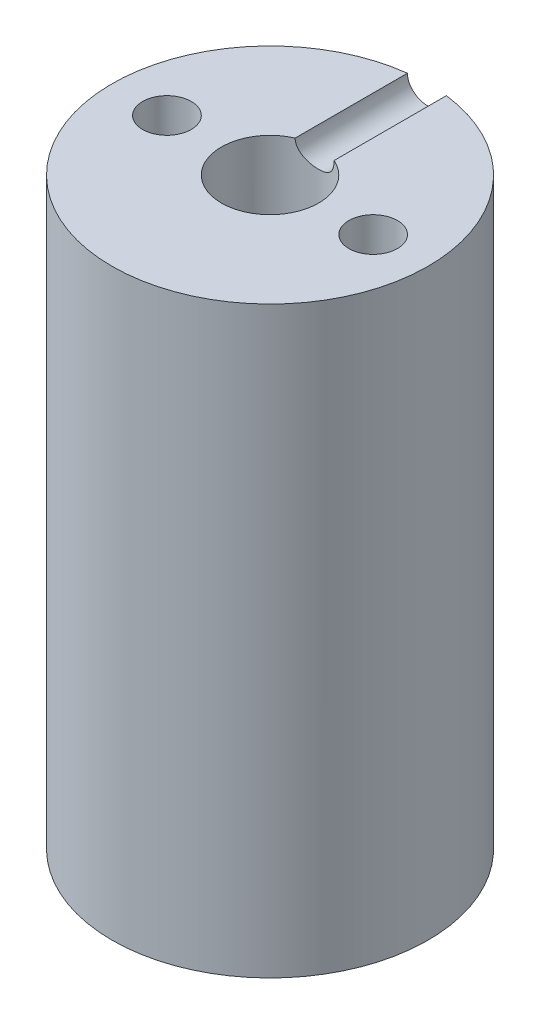
ISO-10303-21;
HEADER;
FILE_DESCRIPTION(('STEP AP214'),'2;1');
FILE_NAME('part.step','',(''),(''),'','','');
FILE_SCHEMA(('AUTOMOTIVE_DESIGN { 1 0 10303 214 1 1 1 1 }'));
ENDSEC;
DATA;
#1=APPLICATION_CONTEXT('core data for automotive mechanical design processes');
#2=APPLICATION_PROTOCOL_DEFINITION('international standard','automotive_design',2000,#1);
#3=PRODUCT_CONTEXT('',#1,'mechanical');
#4=PRODUCT('Part','Part','',(#3));
#5=PRODUCT_RELATED_PRODUCT_CATEGORY('part','',(#4));
#6=PRODUCT_DEFINITION_FORMATION('','',#4);
#7=PRODUCT_DEFINITION_CONTEXT('part definition',#1,'design');
#8=PRODUCT_DEFINITION('design','',#6,#7);
#9=PRODUCT_DEFINITION_SHAPE('','',#8);
#10=(LENGTH_UNIT() NAMED_UNIT(*) SI_UNIT(.MILLI.,.METRE.));
#11=(NAMED_UNIT(*) PLANE_ANGLE_UNIT() SI_UNIT($,.RADIAN.));
#12=(NAMED_UNIT(*) SI_UNIT($,.STERADIAN.) SOLID_ANGLE_UNIT());
#13=UNCERTAINTY_MEASURE_WITH_UNIT(LENGTH_MEASURE(1.E-05),#10,'distance_accuracy_value','');
#14=(GEOMETRIC_REPRESENTATION_CONTEXT(3) GLOBAL_UNCERTAINTY_ASSIGNED_CONTEXT((#13)) GLOBAL_UNIT_ASSIGNED_CONTEXT((#10,
#11,#12)) REPRESENTATION_CONTEXT('',''));
#15=CARTESIAN_POINT('',(0.,0.,0.));
#16=DIRECTION('',(0.,0.,1.));
#17=DIRECTION('',(1.,0.,0.));
#18=AXIS2_PLACEMENT_3D('',#15,#16,#17);
#19=CARTESIAN_POINT('',(0.,76.2,0.));
#20=DIRECTION('',(0.,-1.,0.));
#21=DIRECTION('',(0.,0.,-1.));
#22=AXIS2_PLACEMENT_3D('',#19,#20,#21);
#23=CYLINDRICAL_SURFACE('',#22,20.6375);
#24=CARTESIAN_POINT('',(0.,76.2,0.));
#25=DIRECTION('',(0.,1.,0.));
#26=DIRECTION('',(0.,0.,1.));
#27=AXIS2_PLACEMENT_3D('',#24,#25,#26);
#28=CIRCLE('',#27,20.6375);
#29=CARTESIAN_POINT('',(-2.54,76.2,-20.4805958470451));
#30=VERTEX_POINT('',#29);
#31=CARTESIAN_POINT('',(2.54,76.2,-20.4805958470451));
#32=VERTEX_POINT('',#31);
#33=EDGE_CURVE('E53',#30,#32,#28,.T.);
#34=ORIENTED_EDGE('',*,*,#33,.F.);
#35=CARTESIAN_POINT('',(-2.54,76.2,-20.4805958470451));
#36=CARTESIAN_POINT('',(-2.5400071588606,76.1288480355115,-20.4805921809015));
#37=CARTESIAN_POINT('',(-2.53701032269649,76.0576996859673,-20.4809665544155));
#38=CARTESIAN_POINT('',(-2.52506411090304,75.915917352227,-20.4824442830245));
#39=CARTESIAN_POINT('',(-2.51611518832987,75.8452833292955,-20.4835475826356));
#40=CARTESIAN_POINT('',(-2.49233229465288,75.705096864364,-20.4864545997556));
#41=CARTESIAN_POINT('',(-2.47750429621881,75.6355433988978,-20.4882576063791));
#42=CARTESIAN_POINT('',(-2.44208770085148,75.4979596282379,-20.4925090968478));
#43=CARTESIAN_POINT('',(-2.42149913929293,75.4299293136936,-20.4949575767292));
#44=CARTESIAN_POINT('',(-2.35127370838327,75.2287969813616,-20.5031747572653));
#45=CARTESIAN_POINT('',(-2.29316365377516,75.0985748527493,-20.509816946158));
#46=CARTESIAN_POINT('',(-2.15610559582313,74.8498127921764,-20.5246762047259));
#47=CARTESIAN_POINT('',(-2.07715929335851,74.731271907751,-20.5328931458378));
#48=CARTESIAN_POINT('',(-1.90019791291911,74.5085018373569,-20.5500261106532));
#49=CARTESIAN_POINT('',(-1.80209402692225,74.4043433171231,-20.5589452700302));
#50=CARTESIAN_POINT('',(-1.5897873659417,74.2139189052477,-20.5764502624073));
#51=CARTESIAN_POINT('',(-1.47558214188864,74.1276557404939,-20.5850360444459));
#52=CARTESIAN_POINT('',(-1.23387054160637,73.9752212285859,-20.6009384026917));
#53=CARTESIAN_POINT('',(-1.10632299970461,73.9091146833245,-20.608250853591));
#54=CARTESIAN_POINT('',(-0.841839477743067,73.799290389379,-20.6207472905727));
#55=CARTESIAN_POINT('',(-0.704904393498588,73.7555705077887,-20.6259314794174));
#56=CARTESIAN_POINT('',(-0.42626121046321,73.6919690022915,-20.633565487627));
#57=CARTESIAN_POINT('',(-0.2845807789102,73.6719678391385,-20.6360290144145));
#58=CARTESIAN_POINT('',(0.000149071372596135,73.6560011471766,-20.6379909449255));
#59=CARTESIAN_POINT('',(0.14319847093767,73.6600352823782,-20.6374893900978));
#60=CARTESIAN_POINT('',(0.425784783451287,73.691929591275,-20.633588661675));
#61=CARTESIAN_POINT('',(0.565336530118757,73.7196605297987,-20.6302052054183));
#62=CARTESIAN_POINT('',(0.837789547361134,73.7979591889525,-20.6209385631256));
#63=CARTESIAN_POINT('',(0.970690730687044,73.848527209096,-20.6150553443047));
#64=CARTESIAN_POINT('',(1.22647394699941,73.9712034185426,-20.6014230665233));
#65=CARTESIAN_POINT('',(1.34932863545446,74.0433680573713,-20.5936691282754));
#66=CARTESIAN_POINT('',(1.58122727019245,74.2071449762817,-20.5771635946295));
#67=CARTESIAN_POINT('',(1.69027118836836,74.2987572959413,-20.5684119972011));
#68=CARTESIAN_POINT('',(1.89220396367486,74.4995385730927,-20.5508231307746));
#69=CARTESIAN_POINT('',(1.98498321445238,74.6088177700546,-20.5419856746523));
#70=CARTESIAN_POINT('',(2.15092748188035,74.8414970416285,-20.525274615356));
#71=CARTESIAN_POINT('',(2.22408665758268,74.9649013057445,-20.5174012995872));
#72=CARTESIAN_POINT('',(2.34871830213628,75.222440824418,-20.5035089759848));
#73=CARTESIAN_POINT('',(2.40016923674,75.3565865782031,-20.4974918110077));
#74=CARTESIAN_POINT('',(2.47970808533735,75.631606962008,-20.4880229745246));
#75=CARTESIAN_POINT('',(2.50783119459685,75.7724711149785,-20.4845674390652));
#76=CARTESIAN_POINT('',(2.52927389550729,75.9619554690381,-20.4819235361353));
#77=CARTESIAN_POINT('',(2.53329810044395,76.0095162489759,-20.4814260031924));
#78=CARTESIAN_POINT('',(2.53865755227299,76.104711313363,-20.480762547683));
#79=CARTESIAN_POINT('',(2.53999730397778,76.1523453402007,-20.480596069573));
#80=CARTESIAN_POINT('',(2.54,76.2,-20.4805958470451));
#81=B_SPLINE_CURVE_WITH_KNOTS('',3,(#35,#36,#37,#38,#39,#40,#41,#42,#43,#44,#45,#46,#47,#48,#49,
#50,#51,#52,#53,#54,#55,#56,#57,#58,#59,#60,#61,#62,#63,#64,#65,#66,#67,#68,#69,#70,#71,#72,#73,
#74,#75,#76,#77,#78,#79,#80),.UNSPECIFIED.,.F.,.F.,(4,2,2,2,2,2,2,2,2,2,2,2,2,2,2,2,2,2,2,2,2,2,
4),(0.,0.213385389863619,0.426754539287415,0.63990747591402,0.853059103630533,1.27912573596953,
1.70515759890545,2.13321340539498,2.56133439104137,2.9908175810027,3.42025984401112,
3.84752844912171,4.27479108145877,4.69973831665756,5.12469112529465,5.55076452924861,
5.97683880031326,6.40568234442481,6.83465341502585,7.26404902363532,7.69279560805967,
7.83593965688664,7.97884329215184),.UNSPECIFIED.);
#82=EDGE_CURVE('E64',#30,#32,#81,.T.);
#83=ORIENTED_EDGE('',*,*,#82,.T.);
#84=EDGE_LOOP('',(#34,#83));
#85=FACE_BOUND('',#84,.T.);
#86=CARTESIAN_POINT('',(0.,0.,0.));
#87=DIRECTION('',(0.,1.,0.));
#88=DIRECTION('',(0.,0.,1.));
#89=AXIS2_PLACEMENT_3D('',#86,#87,#88);
#90=CIRCLE('',#89,20.6375);
#91=CARTESIAN_POINT('',(0.,0.,20.6375));
#92=VERTEX_POINT('',#91);
#93=EDGE_CURVE('E89',#92,#92,#90,.T.);
#94=ORIENTED_EDGE('',*,*,#93,.T.);
#95=EDGE_LOOP('',(#94));
#96=FACE_BOUND('',#95,.T.);
#97=ADVANCED_FACE('F38',(#85,#96),#23,.T.);
#98=CARTESIAN_POINT('',(0.,76.2,0.));
#99=DIRECTION('',(0.,1.,0.));
#100=DIRECTION('',(0.,0.,1.));
#101=AXIS2_PLACEMENT_3D('',#98,#99,#100);
#102=PLANE('',#101);
#103=CARTESIAN_POINT('',(-13.462,76.2,0.));
#104=DIRECTION('',(0.,1.,0.));
#105=DIRECTION('',(0.,0.,1.));
#106=AXIS2_PLACEMENT_3D('',#103,#104,#105);
#107=CIRCLE('',#106,3.175);
#108=CARTESIAN_POINT('',(-13.462,76.2,3.175));
#109=VERTEX_POINT('',#108);
#110=EDGE_CURVE('E187',#109,#109,#107,.T.);
#111=ORIENTED_EDGE('',*,*,#110,.F.);
#112=EDGE_LOOP('',(#111));
#113=FACE_BOUND('',#112,.T.);
#114=CARTESIAN_POINT('',(13.462,76.2,0.));
#115=DIRECTION('',(0.,1.,0.));
#116=DIRECTION('',(0.,0.,-1.));
#117=AXIS2_PLACEMENT_3D('',#114,#115,#116);
#118=CIRCLE('',#117,3.175);
#119=CARTESIAN_POINT('',(13.462,76.2,-3.175));
#120=VERTEX_POINT('',#119);
#121=EDGE_CURVE('E179',#120,#120,#118,.T.);
#122=ORIENTED_EDGE('',*,*,#121,.F.);
#123=EDGE_LOOP('',(#122));
#124=FACE_BOUND('',#123,.T.);
#125=DIRECTION('',(0.,0.,1.));
#126=VECTOR('',#125,1.);
#127=CARTESIAN_POINT('',(-2.54,76.2,0.));
#128=LINE('',#127,#126);
#129=CARTESIAN_POINT('',(-2.54,76.2,-5.81987113259392));
#130=VERTEX_POINT('',#129);
#131=EDGE_CURVE('E60',#30,#130,#128,.T.);
#132=ORIENTED_EDGE('',*,*,#131,.F.);
#133=ORIENTED_EDGE('',*,*,#33,.T.);
#134=DIRECTION('',(0.,0.,1.));
#135=VECTOR('',#134,1.);
#136=CARTESIAN_POINT('',(2.54,76.2,0.));
#137=LINE('',#136,#135);
#138=CARTESIAN_POINT('',(2.54,76.2,-5.81987113259392));
#139=VERTEX_POINT('',#138);
#140=EDGE_CURVE('E70',#139,#32,#137,.F.);
#141=ORIENTED_EDGE('',*,*,#140,.F.);
#142=CARTESIAN_POINT('',(0.,76.2,0.));
#143=DIRECTION('',(0.,1.,0.));
#144=DIRECTION('',(0.,0.,1.));
#145=AXIS2_PLACEMENT_3D('',#142,#143,#144);
#146=CIRCLE('',#145,6.35);
#147=EDGE_CURVE('E77',#130,#139,#146,.T.);
#148=ORIENTED_EDGE('',*,*,#147,.F.);
#149=EDGE_LOOP('',(#132,#133,#141,#148));
#150=FACE_BOUND('',#149,.T.);
#151=ADVANCED_FACE('F76',(#113,#124,#150),#102,.T.);
#152=CARTESIAN_POINT('',(0.,0.,0.));
#153=DIRECTION('',(0.,1.,0.));
#154=DIRECTION('',(0.,0.,1.));
#155=AXIS2_PLACEMENT_3D('',#152,#153,#154);
#156=PLANE('',#155);
#157=ORIENTED_EDGE('',*,*,#93,.F.);
#158=EDGE_LOOP('',(#157));
#159=FACE_BOUND('',#158,.T.);
#160=ADVANCED_FACE('F99',(#159),#156,.F.);
#161=CARTESIAN_POINT('',(0.,38.1,0.));
#162=DIRECTION('',(0.,1.,0.));
#163=DIRECTION('',(0.,0.,1.));
#164=AXIS2_PLACEMENT_3D('',#161,#162,#163);
#165=CYLINDRICAL_SURFACE('',#164,6.35);
#166=CARTESIAN_POINT('',(0.,38.1,0.));
#167=DIRECTION('',(0.,1.,0.));
#168=DIRECTION('',(0.,0.,1.));
#169=AXIS2_PLACEMENT_3D('',#166,#167,#168);
#170=CIRCLE('',#169,6.35);
#171=CARTESIAN_POINT('',(0.,38.1,6.35));
#172=VERTEX_POINT('',#171);
#173=EDGE_CURVE('E84',#172,#172,#170,.T.);
#174=ORIENTED_EDGE('',*,*,#173,.F.);
#175=EDGE_LOOP('',(#174));
#176=FACE_BOUND('',#175,.T.);
#177=ORIENTED_EDGE('',*,*,#147,.T.);
#178=CARTESIAN_POINT('',(2.54,76.2,-5.81987113259392));
#179=CARTESIAN_POINT('',(2.54001013506161,76.1316665673217,-5.81985709877384));
#180=CARTESIAN_POINT('',(2.53724272034852,76.0633408047418,-5.821074287182));
#181=CARTESIAN_POINT('',(2.52623200586277,75.9272404512165,-5.8258662428028));
#182=CARTESIAN_POINT('',(2.51799079165366,75.8594656602978,-5.82944011209652));
#183=CARTESIAN_POINT('',(2.49615456668989,75.7252145366203,-5.83882224309212));
#184=CARTESIAN_POINT('',(2.48258071961951,75.6587341482641,-5.84462167011267));
#185=CARTESIAN_POINT('',(2.45023170342138,75.5272800199226,-5.85825667686786));
#186=CARTESIAN_POINT('',(2.43145621679704,75.462306372168,-5.86609238089056));
#187=CARTESIAN_POINT('',(2.36762254177773,75.2704414697609,-5.89228299885495));
#188=CARTESIAN_POINT('',(2.31501301614209,75.146339127024,-5.91334160429937));
#189=CARTESIAN_POINT('',(2.19136203322062,74.908669613295,-5.96026710872033));
#190=CARTESIAN_POINT('',(2.12030305347894,74.7951125977387,-5.98613857207289));
#191=CARTESIAN_POINT('',(1.95747431385804,74.5753367562237,-6.04140269240685));
#192=CARTESIAN_POINT('',(1.86482880770765,74.4697936345113,-6.07090791957106));
#193=CARTESIAN_POINT('',(1.66331450643783,74.2752638542923,-6.12918243996794));
#194=CARTESIAN_POINT('',(1.55444238894593,74.1862805948005,-6.15795158107147));
#195=CARTESIAN_POINT('',(1.31826750327388,74.0239738793715,-6.21288339724724));
#196=CARTESIAN_POINT('',(1.1904064749747,73.9514080922373,-6.23889817170281));
#197=CARTESIAN_POINT('',(0.923066661923293,73.8291080276854,-6.28401009038758));
#198=CARTESIAN_POINT('',(0.783592754663287,73.7793642214544,-6.30311012101127));
#199=CARTESIAN_POINT('',(0.50414865044553,73.7065566743356,-6.33143659610334));
#200=CARTESIAN_POINT('',(0.364529439244347,73.6823177723498,-6.34109631635825));
#201=CARTESIAN_POINT('',(0.0828909066796626,73.6574238304691,-6.35101993955421));
#202=CARTESIAN_POINT('',(-0.0591275465712331,73.6567604357103,-6.35128717107505));
#203=CARTESIAN_POINT('',(-0.333036387807749,73.6783932057329,-6.34265889257385));
#204=CARTESIAN_POINT('',(-0.465047587182576,73.6994018092755,-6.33427721692996));
#205=CARTESIAN_POINT('',(-0.723486978857285,73.7615916523585,-6.30998573461176));
#206=CARTESIAN_POINT('',(-0.849914854746549,73.8027740335651,-6.29407550188619));
#207=CARTESIAN_POINT('',(-1.09587987461522,73.9046480964572,-6.25597974858417));
#208=CARTESIAN_POINT('',(-1.21528440122008,73.9656245358219,-6.23370323932263));
#209=CARTESIAN_POINT('',(-1.4424754858965,74.1050900275232,-6.1850854455788));
#210=CARTESIAN_POINT('',(-1.5502579483629,74.1835852237347,-6.15874273607117));
#211=CARTESIAN_POINT('',(-1.75864950871243,74.3618581088975,-6.10262664057142));
#212=CARTESIAN_POINT('',(-1.85832458268595,74.4626939427147,-6.07274156392338));
#213=CARTESIAN_POINT('',(-2.03974606122483,74.6797847207207,-6.01423677124468));
#214=CARTESIAN_POINT('',(-2.1214842978397,74.796046651028,-5.9856176364063));
#215=CARTESIAN_POINT('',(-2.26686945582334,75.0448972607396,-5.93211524880075));
#216=CARTESIAN_POINT('',(-2.32992843918133,75.1778593425671,-5.90736311739907));
#217=CARTESIAN_POINT('',(-2.43232048911978,75.4536991360169,-5.86595353417017));
#218=CARTESIAN_POINT('',(-2.47169553922447,75.5965587981179,-5.84928176886729));
#219=CARTESIAN_POINT('',(-2.5121943891885,75.8174044153816,-5.83194545483372));
#220=CARTESIAN_POINT('',(-2.52260741560886,75.8934950876132,-5.82743865854726));
#221=CARTESIAN_POINT('',(-2.53651108271748,76.0463744741239,-5.82139476198816));
#222=CARTESIAN_POINT('',(-2.54000598891897,76.1231627289315,-5.81985583183));
#223=CARTESIAN_POINT('',(-2.54,76.2,-5.81987113259392));
#224=B_SPLINE_CURVE_WITH_KNOTS('',3,(#178,#179,#180,#181,#182,#183,#184,#185,#186,#187,#188,
#189,#190,#191,#192,#193,#194,#195,#196,#197,#198,#199,#200,#201,#202,#203,#204,#205,#206,#207,
#208,#209,#210,#211,#212,#213,#214,#215,#216,#217,#218,#219,#220,#221,#222,#223),.UNSPECIFIED.,
.F.,.F.,(4,2,2,2,2,2,2,2,2,2,2,2,2,2,2,2,2,2,2,2,2,2,4),(0.,0.204920663435501,0.40976329513167,
0.613801047289903,0.817851256207235,1.22514741220868,1.63283182377135,2.06143920954285,
2.49013447284775,2.93576830835721,3.38121590960601,3.80509623160424,4.22882633423615,
4.62875522379612,5.02870674858182,5.43468784697986,5.84081154838935,6.27356980836772,
6.70652472768326,7.15193186765878,7.59654710801328,7.82701244547751,8.05733564035148),.UNSPECIFIED.);
#225=EDGE_CURVE('E11',#139,#130,#224,.T.);
#226=ORIENTED_EDGE('',*,*,#225,.T.);
#227=EDGE_LOOP('',(#177,#226));
#228=FACE_BOUND('',#227,.T.);
#229=ADVANCED_FACE('F82',(#176,#228),#165,.F.);
#230=CARTESIAN_POINT('',(0.,38.1,0.));
#231=DIRECTION('',(0.,1.,0.));
#232=DIRECTION('',(0.,0.,1.));
#233=AXIS2_PLACEMENT_3D('',#230,#231,#232);
#234=PLANE('',#233);
#235=ORIENTED_EDGE('',*,*,#173,.T.);
#236=EDGE_LOOP('',(#235));
#237=FACE_BOUND('',#236,.T.);
#238=ADVANCED_FACE('F105',(#237),#234,.T.);
#239=CARTESIAN_POINT('',(0.,76.2,0.));
#240=DIRECTION('',(0.,0.,1.));
#241=DIRECTION('',(1.,0.,0.));
#242=AXIS2_PLACEMENT_3D('',#239,#240,#241);
#243=CYLINDRICAL_SURFACE('',#242,2.54);
#244=ORIENTED_EDGE('',*,*,#131,.T.);
#245=ORIENTED_EDGE('',*,*,#225,.F.);
#246=ORIENTED_EDGE('',*,*,#140,.T.);
#247=ORIENTED_EDGE('',*,*,#82,.F.);
#248=EDGE_LOOP('',(#244,#245,#246,#247));
#249=FACE_BOUND('',#248,.T.);
#250=ADVANCED_FACE('F69',(#249),#243,.F.);
#251=CARTESIAN_POINT('',(13.462,69.85,0.));
#252=DIRECTION('',(0.,1.,0.));
#253=DIRECTION('',(0.,0.,1.));
#254=AXIS2_PLACEMENT_3D('',#251,#252,#253);
#255=CYLINDRICAL_SURFACE('',#254,3.175);
#256=CARTESIAN_POINT('',(13.462,69.85,0.));
#257=DIRECTION('',(0.,1.,0.));
#258=DIRECTION('',(0.,0.,-1.));
#259=AXIS2_PLACEMENT_3D('',#256,#257,#258);
#260=CIRCLE('',#259,3.175);
#261=CARTESIAN_POINT('',(13.462,69.85,-3.175));
#262=VERTEX_POINT('',#261);
#263=EDGE_CURVE('E183',#262,#262,#260,.T.);
#264=ORIENTED_EDGE('',*,*,#263,.F.);
#265=EDGE_LOOP('',(#264));
#266=FACE_BOUND('',#265,.T.);
#267=ORIENTED_EDGE('',*,*,#121,.T.);
#268=EDGE_LOOP('',(#267));
#269=FACE_BOUND('',#268,.T.);
#270=ADVANCED_FACE('F129',(#266,#269),#255,.F.);
#271=CARTESIAN_POINT('',(13.462,69.85,0.));
#272=DIRECTION('',(0.,-1.,0.));
#273=DIRECTION('',(0.,0.,-1.));
#274=AXIS2_PLACEMENT_3D('',#271,#272,#273);
#275=PLANE('',#274);
#276=ORIENTED_EDGE('',*,*,#263,.T.);
#277=EDGE_LOOP('',(#276));
#278=FACE_BOUND('',#277,.T.);
#279=ADVANCED_FACE('F134',(#278),#275,.F.);
#280=CARTESIAN_POINT('',(-13.462,69.85,0.));
#281=DIRECTION('',(0.,1.,0.));
#282=DIRECTION('',(0.,0.,1.));
#283=AXIS2_PLACEMENT_3D('',#280,#281,#282);
#284=CYLINDRICAL_SURFACE('',#283,3.175);
#285=CARTESIAN_POINT('',(-13.462,69.85,0.));
#286=DIRECTION('',(0.,1.,0.));
#287=DIRECTION('',(0.,0.,1.));
#288=AXIS2_PLACEMENT_3D('',#285,#286,#287);
#289=CIRCLE('',#288,3.175);
#290=CARTESIAN_POINT('',(-13.462,69.85,3.175));
#291=VERTEX_POINT('',#290);
#292=EDGE_CURVE('E80',#291,#291,#289,.T.);
#293=ORIENTED_EDGE('',*,*,#292,.F.);
#294=EDGE_LOOP('',(#293));
#295=FACE_BOUND('',#294,.T.);
#296=ORIENTED_EDGE('',*,*,#110,.T.);
#297=EDGE_LOOP('',(#296));
#298=FACE_BOUND('',#297,.T.);
#299=ADVANCED_FACE('F144',(#295,#298),#284,.F.);
#300=CARTESIAN_POINT('',(-13.462,69.85,0.));
#301=DIRECTION('',(0.,1.,0.));
#302=DIRECTION('',(0.,0.,1.));
#303=AXIS2_PLACEMENT_3D('',#300,#301,#302);
#304=PLANE('',#303);
#305=ORIENTED_EDGE('',*,*,#292,.T.);
#306=EDGE_LOOP('',(#305));
#307=FACE_BOUND('',#306,.T.);
#308=ADVANCED_FACE('F154',(#307),#304,.T.);
#309=CLOSED_SHELL('',(#97,#151,#160,#229,#238,#250,#270,#279,#299,#308));
#310=MANIFOLD_SOLID_BREP('B2',#309);
#311=ADVANCED_BREP_SHAPE_REPRESENTATION('',(#18,#310),#14);
#312=SHAPE_DEFINITION_REPRESENTATION(#9,#311);
ENDSEC;
END-ISO-10303-21;
